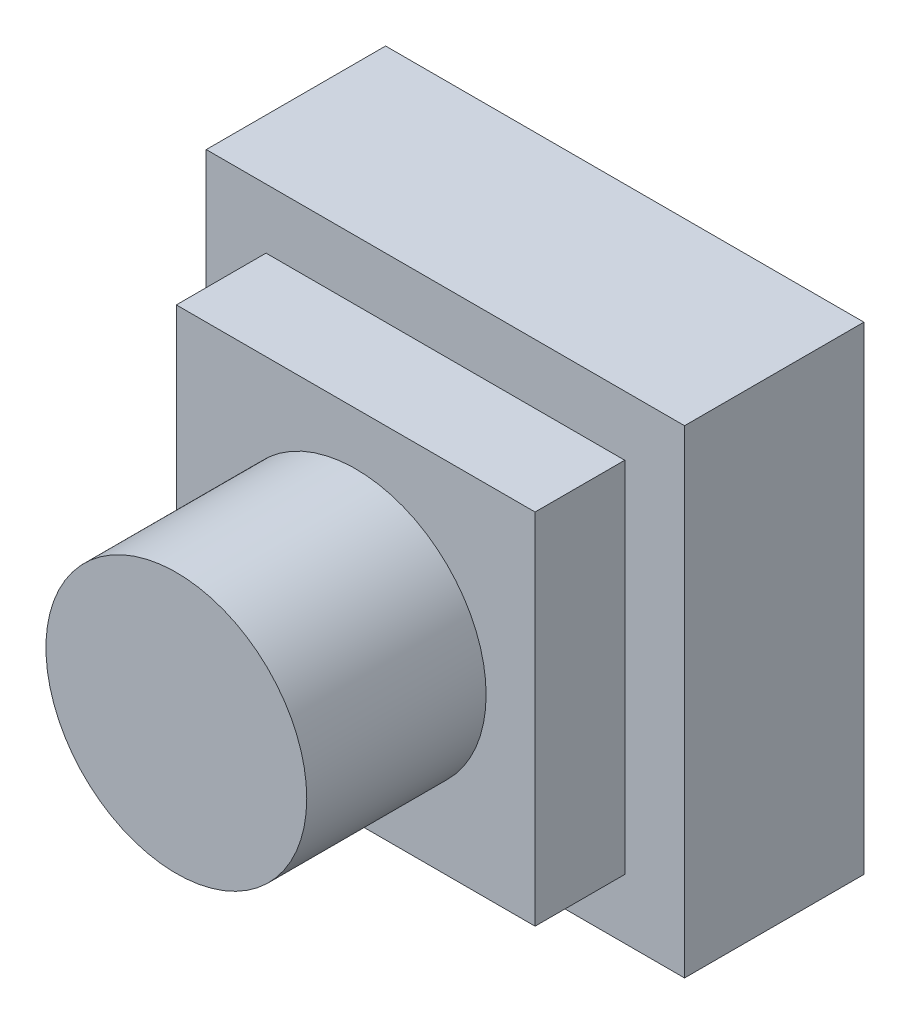
ISO-10303-21;
HEADER;
FILE_DESCRIPTION(('STEP AP214'),'2;1');
FILE_NAME('part.step','',(''),(''),'','','');
FILE_SCHEMA(('AUTOMOTIVE_DESIGN { 1 0 10303 214 1 1 1 1 }'));
ENDSEC;
DATA;
#1=APPLICATION_CONTEXT('core data for automotive mechanical design processes');
#2=APPLICATION_PROTOCOL_DEFINITION('international standard','automotive_design',2000,#1);
#3=PRODUCT_CONTEXT('',#1,'mechanical');
#4=PRODUCT('Part','Part','',(#3));
#5=PRODUCT_RELATED_PRODUCT_CATEGORY('part','',(#4));
#6=PRODUCT_DEFINITION_FORMATION('','',#4);
#7=PRODUCT_DEFINITION_CONTEXT('part definition',#1,'design');
#8=PRODUCT_DEFINITION('design','',#6,#7);
#9=PRODUCT_DEFINITION_SHAPE('','',#8);
#10=(LENGTH_UNIT() NAMED_UNIT(*) SI_UNIT(.MILLI.,.METRE.));
#11=(NAMED_UNIT(*) PLANE_ANGLE_UNIT() SI_UNIT($,.RADIAN.));
#12=(NAMED_UNIT(*) SI_UNIT($,.STERADIAN.) SOLID_ANGLE_UNIT());
#13=UNCERTAINTY_MEASURE_WITH_UNIT(LENGTH_MEASURE(1.E-05),#10,'distance_accuracy_value','');
#14=(GEOMETRIC_REPRESENTATION_CONTEXT(3) GLOBAL_UNCERTAINTY_ASSIGNED_CONTEXT((#13)) GLOBAL_UNIT_ASSIGNED_CONTEXT((#10,
#11,#12)) REPRESENTATION_CONTEXT('',''));
#15=CARTESIAN_POINT('',(0.,0.,0.));
#16=DIRECTION('',(0.,0.,1.));
#17=DIRECTION('',(1.,0.,0.));
#18=AXIS2_PLACEMENT_3D('',#15,#16,#17);
#19=CARTESIAN_POINT('',(0.,0.,-1.5));
#20=DIRECTION('',(-1.,0.,0.));
#21=DIRECTION('',(0.,0.,1.));
#22=AXIS2_PLACEMENT_3D('',#19,#20,#21);
#23=PLANE('',#22);
#24=DIRECTION('',(0.,-1.,0.));
#25=VECTOR('',#24,1.);
#26=CARTESIAN_POINT('',(0.,0.,0.));
#27=LINE('',#26,#25);
#28=CARTESIAN_POINT('',(0.,6.,0.));
#29=VERTEX_POINT('',#28);
#30=CARTESIAN_POINT('',(0.,0.,0.));
#31=VERTEX_POINT('',#30);
#32=EDGE_CURVE('E123',#29,#31,#27,.T.);
#33=ORIENTED_EDGE('',*,*,#32,.F.);
#34=DIRECTION('',(0.,0.,1.));
#35=VECTOR('',#34,1.);
#36=CARTESIAN_POINT('',(0.,6.,-1.5));
#37=LINE('',#36,#35);
#38=CARTESIAN_POINT('',(0.,6.,-1.5));
#39=VERTEX_POINT('',#38);
#40=EDGE_CURVE('E51',#39,#29,#37,.T.);
#41=ORIENTED_EDGE('',*,*,#40,.F.);
#42=DIRECTION('',(0.,-1.,0.));
#43=VECTOR('',#42,1.);
#44=CARTESIAN_POINT('',(0.,0.,-1.5));
#45=LINE('',#44,#43);
#46=CARTESIAN_POINT('',(0.,0.,-1.5));
#47=VERTEX_POINT('',#46);
#48=EDGE_CURVE('E101',#39,#47,#45,.T.);
#49=ORIENTED_EDGE('',*,*,#48,.T.);
#50=DIRECTION('',(0.,0.,1.));
#51=VECTOR('',#50,1.);
#52=CARTESIAN_POINT('',(0.,0.,-1.5));
#53=LINE('',#52,#51);
#54=EDGE_CURVE('E44',#47,#31,#53,.T.);
#55=ORIENTED_EDGE('',*,*,#54,.T.);
#56=EDGE_LOOP('',(#33,#41,#49,#55));
#57=FACE_BOUND('',#56,.T.);
#58=ADVANCED_FACE('F41',(#57),#23,.T.);
#59=CARTESIAN_POINT('',(0.,6.,-1.5));
#60=DIRECTION('',(0.,1.,0.));
#61=DIRECTION('',(0.,0.,1.));
#62=AXIS2_PLACEMENT_3D('',#59,#60,#61);
#63=PLANE('',#62);
#64=DIRECTION('',(-1.,0.,0.));
#65=VECTOR('',#64,1.);
#66=CARTESIAN_POINT('',(0.,6.,0.));
#67=LINE('',#66,#65);
#68=CARTESIAN_POINT('',(6.,6.,0.));
#69=VERTEX_POINT('',#68);
#70=EDGE_CURVE('E92',#69,#29,#67,.T.);
#71=ORIENTED_EDGE('',*,*,#70,.F.);
#72=DIRECTION('',(0.,0.,1.));
#73=VECTOR('',#72,1.);
#74=CARTESIAN_POINT('',(6.,6.,-1.5));
#75=LINE('',#74,#73);
#76=CARTESIAN_POINT('',(6.,6.,-1.5));
#77=VERTEX_POINT('',#76);
#78=EDGE_CURVE('E76',#77,#69,#75,.T.);
#79=ORIENTED_EDGE('',*,*,#78,.F.);
#80=DIRECTION('',(-1.,0.,0.));
#81=VECTOR('',#80,1.);
#82=CARTESIAN_POINT('',(0.,6.,-1.5));
#83=LINE('',#82,#81);
#84=EDGE_CURVE('E114',#77,#39,#83,.T.);
#85=ORIENTED_EDGE('',*,*,#84,.T.);
#86=ORIENTED_EDGE('',*,*,#40,.T.);
#87=EDGE_LOOP('',(#71,#79,#85,#86));
#88=FACE_BOUND('',#87,.T.);
#89=ADVANCED_FACE('F97',(#88),#63,.T.);
#90=CARTESIAN_POINT('',(6.,0.,-1.5));
#91=DIRECTION('',(1.,0.,0.));
#92=DIRECTION('',(0.,0.,-1.));
#93=AXIS2_PLACEMENT_3D('',#90,#91,#92);
#94=PLANE('',#93);
#95=DIRECTION('',(0.,1.,0.));
#96=VECTOR('',#95,1.);
#97=CARTESIAN_POINT('',(6.,0.,0.));
#98=LINE('',#97,#96);
#99=CARTESIAN_POINT('',(6.,0.,0.));
#100=VERTEX_POINT('',#99);
#101=EDGE_CURVE('E79',#100,#69,#98,.T.);
#102=ORIENTED_EDGE('',*,*,#101,.F.);
#103=DIRECTION('',(0.,0.,1.));
#104=VECTOR('',#103,1.);
#105=CARTESIAN_POINT('',(6.,0.,-1.5));
#106=LINE('',#105,#104);
#107=CARTESIAN_POINT('',(6.,0.,-1.5));
#108=VERTEX_POINT('',#107);
#109=EDGE_CURVE('E86',#108,#100,#106,.T.);
#110=ORIENTED_EDGE('',*,*,#109,.F.);
#111=DIRECTION('',(0.,1.,0.));
#112=VECTOR('',#111,1.);
#113=CARTESIAN_POINT('',(6.,0.,-1.5));
#114=LINE('',#113,#112);
#115=EDGE_CURVE('E59',#108,#77,#114,.T.);
#116=ORIENTED_EDGE('',*,*,#115,.T.);
#117=ORIENTED_EDGE('',*,*,#78,.T.);
#118=EDGE_LOOP('',(#102,#110,#116,#117));
#119=FACE_BOUND('',#118,.T.);
#120=ADVANCED_FACE('F78',(#119),#94,.T.);
#121=CARTESIAN_POINT('',(0.,0.,-1.5));
#122=DIRECTION('',(0.,-1.,0.));
#123=DIRECTION('',(0.,0.,-1.));
#124=AXIS2_PLACEMENT_3D('',#121,#122,#123);
#125=PLANE('',#124);
#126=DIRECTION('',(1.,0.,0.));
#127=VECTOR('',#126,1.);
#128=CARTESIAN_POINT('',(0.,0.,0.));
#129=LINE('',#128,#127);
#130=EDGE_CURVE('E94',#31,#100,#129,.T.);
#131=ORIENTED_EDGE('',*,*,#130,.F.);
#132=ORIENTED_EDGE('',*,*,#54,.F.);
#133=DIRECTION('',(1.,0.,0.));
#134=VECTOR('',#133,1.);
#135=CARTESIAN_POINT('',(0.,0.,-1.5));
#136=LINE('',#135,#134);
#137=EDGE_CURVE('E105',#47,#108,#136,.T.);
#138=ORIENTED_EDGE('',*,*,#137,.T.);
#139=ORIENTED_EDGE('',*,*,#109,.T.);
#140=EDGE_LOOP('',(#131,#132,#138,#139));
#141=FACE_BOUND('',#140,.T.);
#142=ADVANCED_FACE('F183',(#141),#125,.T.);
#143=CARTESIAN_POINT('',(0.,0.,0.));
#144=DIRECTION('',(0.,0.,-1.));
#145=DIRECTION('',(-1.,0.,0.));
#146=AXIS2_PLACEMENT_3D('',#143,#144,#145);
#147=PLANE('',#146);
#148=CARTESIAN_POINT('',(3.,2.94366617963969,0.));
#149=DIRECTION('',(0.,0.,1.));
#150=DIRECTION('',(1.,0.,0.));
#151=AXIS2_PLACEMENT_3D('',#148,#149,#150);
#152=CIRCLE('',#151,2.18121414644356);
#153=CARTESIAN_POINT('',(5.18121414644356,2.94366617963969,0.));
#154=VERTEX_POINT('',#153);
#155=EDGE_CURVE('E11',#154,#154,#152,.T.);
#156=ORIENTED_EDGE('',*,*,#155,.F.);
#157=EDGE_LOOP('',(#156));
#158=FACE_BOUND('',#157,.T.);
#159=ORIENTED_EDGE('',*,*,#32,.T.);
#160=ORIENTED_EDGE('',*,*,#130,.T.);
#161=ORIENTED_EDGE('',*,*,#101,.T.);
#162=ORIENTED_EDGE('',*,*,#70,.T.);
#163=EDGE_LOOP('',(#159,#160,#161,#162));
#164=FACE_BOUND('',#163,.T.);
#165=ADVANCED_FACE('F91',(#158,#164),#147,.F.);
#166=CARTESIAN_POINT('',(3.,2.94366617963969,3.));
#167=DIRECTION('',(0.,0.,-1.));
#168=DIRECTION('',(-1.,0.,0.));
#169=AXIS2_PLACEMENT_3D('',#166,#167,#168);
#170=CYLINDRICAL_SURFACE('',#169,2.18121414644356);
#171=CARTESIAN_POINT('',(3.,2.94366617963969,3.));
#172=DIRECTION('',(0.,0.,1.));
#173=DIRECTION('',(1.,0.,0.));
#174=AXIS2_PLACEMENT_3D('',#171,#172,#173);
#175=CIRCLE('',#174,2.18121414644356);
#176=CARTESIAN_POINT('',(5.18121414644356,2.94366617963969,3.));
#177=VERTEX_POINT('',#176);
#178=EDGE_CURVE('E125',#177,#177,#175,.T.);
#179=ORIENTED_EDGE('',*,*,#178,.F.);
#180=EDGE_LOOP('',(#179));
#181=FACE_BOUND('',#180,.T.);
#182=ORIENTED_EDGE('',*,*,#155,.T.);
#183=EDGE_LOOP('',(#182));
#184=FACE_BOUND('',#183,.T.);
#185=ADVANCED_FACE('F225',(#181,#184),#170,.T.);
#186=CARTESIAN_POINT('',(3.,2.94366617963969,3.));
#187=DIRECTION('',(0.,0.,1.));
#188=DIRECTION('',(1.,0.,0.));
#189=AXIS2_PLACEMENT_3D('',#186,#187,#188);
#190=PLANE('',#189);
#191=ORIENTED_EDGE('',*,*,#178,.T.);
#192=EDGE_LOOP('',(#191));
#193=FACE_BOUND('',#192,.T.);
#194=ADVANCED_FACE('F217',(#193),#190,.T.);
#195=CARTESIAN_POINT('',(7.,7.,-4.5));
#196=DIRECTION('',(-1.,0.,0.));
#197=DIRECTION('',(0.,-1.,0.));
#198=AXIS2_PLACEMENT_3D('',#195,#196,#197);
#199=PLANE('',#198);
#200=DIRECTION('',(0.,-1.,0.));
#201=VECTOR('',#200,1.);
#202=CARTESIAN_POINT('',(7.,7.,-1.5));
#203=LINE('',#202,#201);
#204=CARTESIAN_POINT('',(7.,7.,-1.5));
#205=VERTEX_POINT('',#204);
#206=CARTESIAN_POINT('',(7.,-1.,-1.5));
#207=VERTEX_POINT('',#206);
#208=EDGE_CURVE('E174',#205,#207,#203,.T.);
#209=ORIENTED_EDGE('',*,*,#208,.T.);
#210=DIRECTION('',(0.,0.,1.));
#211=VECTOR('',#210,1.);
#212=CARTESIAN_POINT('',(7.,-1.,-4.5));
#213=LINE('',#212,#211);
#214=CARTESIAN_POINT('',(7.,-1.,-4.5));
#215=VERTEX_POINT('',#214);
#216=EDGE_CURVE('E130',#215,#207,#213,.T.);
#217=ORIENTED_EDGE('',*,*,#216,.F.);
#218=DIRECTION('',(0.,-1.,0.));
#219=VECTOR('',#218,1.);
#220=CARTESIAN_POINT('',(7.,7.,-4.5));
#221=LINE('',#220,#219);
#222=CARTESIAN_POINT('',(7.,7.,-4.5));
#223=VERTEX_POINT('',#222);
#224=EDGE_CURVE('E158',#223,#215,#221,.T.);
#225=ORIENTED_EDGE('',*,*,#224,.F.);
#226=DIRECTION('',(0.,0.,1.));
#227=VECTOR('',#226,1.);
#228=CARTESIAN_POINT('',(7.,7.,-4.5));
#229=LINE('',#228,#227);
#230=EDGE_CURVE('E142',#223,#205,#229,.T.);
#231=ORIENTED_EDGE('',*,*,#230,.T.);
#232=EDGE_LOOP('',(#209,#217,#225,#231));
#233=FACE_BOUND('',#232,.T.);
#234=ADVANCED_FACE('F215',(#233),#199,.F.);
#235=CARTESIAN_POINT('',(7.,-1.,-4.5));
#236=DIRECTION('',(0.,1.,0.));
#237=DIRECTION('',(0.,0.,1.));
#238=AXIS2_PLACEMENT_3D('',#235,#236,#237);
#239=PLANE('',#238);
#240=DIRECTION('',(-1.,0.,0.));
#241=VECTOR('',#240,1.);
#242=CARTESIAN_POINT('',(7.,-1.,-1.5));
#243=LINE('',#242,#241);
#244=CARTESIAN_POINT('',(-1.,-1.,-1.5));
#245=VERTEX_POINT('',#244);
#246=EDGE_CURVE('E170',#207,#245,#243,.T.);
#247=ORIENTED_EDGE('',*,*,#246,.T.);
#248=DIRECTION('',(0.,0.,1.));
#249=VECTOR('',#248,1.);
#250=CARTESIAN_POINT('',(-1.,-1.,-4.5));
#251=LINE('',#250,#249);
#252=CARTESIAN_POINT('',(-1.,-1.,-4.5));
#253=VERTEX_POINT('',#252);
#254=EDGE_CURVE('E134',#253,#245,#251,.T.);
#255=ORIENTED_EDGE('',*,*,#254,.F.);
#256=DIRECTION('',(-1.,0.,0.));
#257=VECTOR('',#256,1.);
#258=CARTESIAN_POINT('',(7.,-1.,-4.5));
#259=LINE('',#258,#257);
#260=EDGE_CURVE('E154',#215,#253,#259,.T.);
#261=ORIENTED_EDGE('',*,*,#260,.F.);
#262=ORIENTED_EDGE('',*,*,#216,.T.);
#263=EDGE_LOOP('',(#247,#255,#261,#262));
#264=FACE_BOUND('',#263,.T.);
#265=ADVANCED_FACE('F208',(#264),#239,.F.);
#266=CARTESIAN_POINT('',(-1.,7.,-4.5));
#267=DIRECTION('',(1.,0.,0.));
#268=DIRECTION('',(0.,1.,0.));
#269=AXIS2_PLACEMENT_3D('',#266,#267,#268);
#270=PLANE('',#269);
#271=DIRECTION('',(0.,1.,0.));
#272=VECTOR('',#271,1.);
#273=CARTESIAN_POINT('',(-1.,7.,-1.5));
#274=LINE('',#273,#272);
#275=CARTESIAN_POINT('',(-1.,7.,-1.5));
#276=VERTEX_POINT('',#275);
#277=EDGE_CURVE('E166',#245,#276,#274,.T.);
#278=ORIENTED_EDGE('',*,*,#277,.T.);
#279=DIRECTION('',(0.,0.,1.));
#280=VECTOR('',#279,1.);
#281=CARTESIAN_POINT('',(-1.,7.,-4.5));
#282=LINE('',#281,#280);
#283=CARTESIAN_POINT('',(-1.,7.,-4.5));
#284=VERTEX_POINT('',#283);
#285=EDGE_CURVE('E138',#284,#276,#282,.T.);
#286=ORIENTED_EDGE('',*,*,#285,.F.);
#287=DIRECTION('',(0.,1.,0.));
#288=VECTOR('',#287,1.);
#289=CARTESIAN_POINT('',(-1.,7.,-4.5));
#290=LINE('',#289,#288);
#291=EDGE_CURVE('E150',#253,#284,#290,.T.);
#292=ORIENTED_EDGE('',*,*,#291,.F.);
#293=ORIENTED_EDGE('',*,*,#254,.T.);
#294=EDGE_LOOP('',(#278,#286,#292,#293));
#295=FACE_BOUND('',#294,.T.);
#296=ADVANCED_FACE('F223',(#295),#270,.F.);
#297=CARTESIAN_POINT('',(7.,7.,-4.5));
#298=DIRECTION('',(0.,-1.,0.));
#299=DIRECTION('',(0.,0.,-1.));
#300=AXIS2_PLACEMENT_3D('',#297,#298,#299);
#301=PLANE('',#300);
#302=DIRECTION('',(1.,0.,0.));
#303=VECTOR('',#302,1.);
#304=CARTESIAN_POINT('',(7.,7.,-1.5));
#305=LINE('',#304,#303);
#306=EDGE_CURVE('E162',#276,#205,#305,.T.);
#307=ORIENTED_EDGE('',*,*,#306,.T.);
#308=ORIENTED_EDGE('',*,*,#230,.F.);
#309=DIRECTION('',(1.,0.,0.));
#310=VECTOR('',#309,1.);
#311=CARTESIAN_POINT('',(7.,7.,-4.5));
#312=LINE('',#311,#310);
#313=EDGE_CURVE('E146',#284,#223,#312,.T.);
#314=ORIENTED_EDGE('',*,*,#313,.F.);
#315=ORIENTED_EDGE('',*,*,#285,.T.);
#316=EDGE_LOOP('',(#307,#308,#314,#315));
#317=FACE_BOUND('',#316,.T.);
#318=ADVANCED_FACE('F300',(#317),#301,.F.);
#319=CARTESIAN_POINT('',(0.,0.,-4.5));
#320=DIRECTION('',(0.,0.,-1.));
#321=DIRECTION('',(-1.,0.,0.));
#322=AXIS2_PLACEMENT_3D('',#319,#320,#321);
#323=PLANE('',#322);
#324=ORIENTED_EDGE('',*,*,#224,.T.);
#325=ORIENTED_EDGE('',*,*,#260,.T.);
#326=ORIENTED_EDGE('',*,*,#291,.T.);
#327=ORIENTED_EDGE('',*,*,#313,.T.);
#328=EDGE_LOOP('',(#324,#325,#326,#327));
#329=FACE_BOUND('',#328,.T.);
#330=ADVANCED_FACE('F212',(#329),#323,.T.);
#331=CARTESIAN_POINT('',(0.,0.,-1.5));
#332=DIRECTION('',(0.,0.,-1.));
#333=DIRECTION('',(-1.,0.,0.));
#334=AXIS2_PLACEMENT_3D('',#331,#332,#333);
#335=PLANE('',#334);
#336=ORIENTED_EDGE('',*,*,#48,.F.);
#337=ORIENTED_EDGE('',*,*,#84,.F.);
#338=ORIENTED_EDGE('',*,*,#115,.F.);
#339=ORIENTED_EDGE('',*,*,#137,.F.);
#340=EDGE_LOOP('',(#336,#337,#338,#339));
#341=FACE_BOUND('',#340,.T.);
#342=ORIENTED_EDGE('',*,*,#208,.F.);
#343=ORIENTED_EDGE('',*,*,#306,.F.);
#344=ORIENTED_EDGE('',*,*,#277,.F.);
#345=ORIENTED_EDGE('',*,*,#246,.F.);
#346=EDGE_LOOP('',(#342,#343,#344,#345));
#347=FACE_BOUND('',#346,.T.);
#348=ADVANCED_FACE('F186',(#341,#347),#335,.F.);
#349=CLOSED_SHELL('',(#58,#89,#120,#142,#165,#185,#194,#234,#265,#296,#318,#330,#348));
#350=MANIFOLD_SOLID_BREP('B2',#349);
#351=ADVANCED_BREP_SHAPE_REPRESENTATION('',(#18,#350),#14);
#352=SHAPE_DEFINITION_REPRESENTATION(#9,#351);
ENDSEC;
END-ISO-10303-21;
